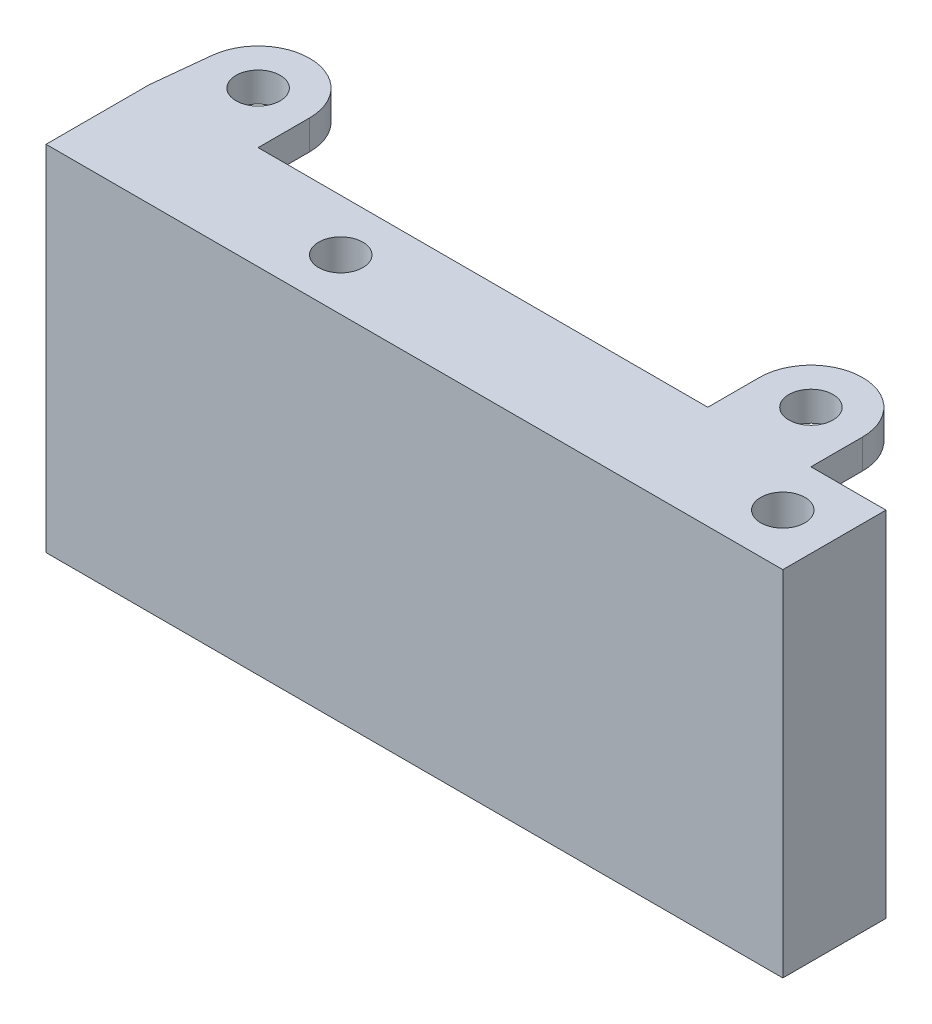
ISO-10303-21;
HEADER;
FILE_DESCRIPTION(('STEP AP214'),'2;1');
FILE_NAME('part.step','',(''),(''),'','','');
FILE_SCHEMA(('AUTOMOTIVE_DESIGN { 1 0 10303 214 1 1 1 1 }'));
ENDSEC;
DATA;
#1=APPLICATION_CONTEXT('core data for automotive mechanical design processes');
#2=APPLICATION_PROTOCOL_DEFINITION('international standard','automotive_design',2000,#1);
#3=PRODUCT_CONTEXT('',#1,'mechanical');
#4=PRODUCT('Part','Part','',(#3));
#5=PRODUCT_RELATED_PRODUCT_CATEGORY('part','',(#4));
#6=PRODUCT_DEFINITION_FORMATION('','',#4);
#7=PRODUCT_DEFINITION_CONTEXT('part definition',#1,'design');
#8=PRODUCT_DEFINITION('design','',#6,#7);
#9=PRODUCT_DEFINITION_SHAPE('','',#8);
#10=(LENGTH_UNIT() NAMED_UNIT(*) SI_UNIT(.MILLI.,.METRE.));
#11=(NAMED_UNIT(*) PLANE_ANGLE_UNIT() SI_UNIT($,.RADIAN.));
#12=(NAMED_UNIT(*) SI_UNIT($,.STERADIAN.) SOLID_ANGLE_UNIT());
#13=UNCERTAINTY_MEASURE_WITH_UNIT(LENGTH_MEASURE(1.E-05),#10,'distance_accuracy_value','');
#14=(GEOMETRIC_REPRESENTATION_CONTEXT(3) GLOBAL_UNCERTAINTY_ASSIGNED_CONTEXT((#13)) GLOBAL_UNIT_ASSIGNED_CONTEXT((#10,
#11,#12)) REPRESENTATION_CONTEXT('',''));
#15=CARTESIAN_POINT('',(0.,0.,0.));
#16=DIRECTION('',(0.,0.,1.));
#17=DIRECTION('',(1.,0.,0.));
#18=AXIS2_PLACEMENT_3D('',#15,#16,#17);
#19=CARTESIAN_POINT('',(0.,0.,0.));
#20=DIRECTION('',(0.,0.,1.));
#21=DIRECTION('',(1.,0.,0.));
#22=AXIS2_PLACEMENT_3D('',#19,#20,#21);
#23=PLANE('',#22);
#24=DIRECTION('',(0.,1.,0.));
#25=VECTOR('',#24,1.);
#26=CARTESIAN_POINT('',(37.910130543709,22.,0.));
#27=LINE('',#26,#25);
#28=CARTESIAN_POINT('',(37.910130543709,22.,0.));
#29=VERTEX_POINT('',#28);
#30=CARTESIAN_POINT('',(37.910130543709,24.,0.));
#31=VERTEX_POINT('',#30);
#32=EDGE_CURVE('E48',#29,#31,#27,.T.);
#33=ORIENTED_EDGE('',*,*,#32,.F.);
#34=DIRECTION('',(-1.,0.,0.));
#35=VECTOR('',#34,1.);
#36=CARTESIAN_POINT('',(50.,22.,0.));
#37=LINE('',#36,#35);
#38=CARTESIAN_POINT('',(44.910130543709,22.,0.));
#39=VERTEX_POINT('',#38);
#40=EDGE_CURVE('E171',#39,#29,#37,.T.);
#41=ORIENTED_EDGE('',*,*,#40,.F.);
#42=DIRECTION('',(0.,1.,0.));
#43=VECTOR('',#42,1.);
#44=CARTESIAN_POINT('',(44.910130543709,22.,0.));
#45=LINE('',#44,#43);
#46=CARTESIAN_POINT('',(44.910130543709,24.,0.));
#47=VERTEX_POINT('',#46);
#48=EDGE_CURVE('E326',#39,#47,#45,.T.);
#49=ORIENTED_EDGE('',*,*,#48,.T.);
#50=DIRECTION('',(-1.,0.,0.));
#51=VECTOR('',#50,1.);
#52=CARTESIAN_POINT('',(50.,24.,0.));
#53=LINE('',#52,#51);
#54=CARTESIAN_POINT('',(50.,24.,0.));
#55=VERTEX_POINT('',#54);
#56=EDGE_CURVE('E294',#55,#47,#53,.T.);
#57=ORIENTED_EDGE('',*,*,#56,.F.);
#58=DIRECTION('',(0.,1.,0.));
#59=VECTOR('',#58,1.);
#60=CARTESIAN_POINT('',(50.,0.,0.));
#61=LINE('',#60,#59);
#62=CARTESIAN_POINT('',(50.,0.,0.));
#63=VERTEX_POINT('',#62);
#64=EDGE_CURVE('E308',#63,#55,#61,.T.);
#65=ORIENTED_EDGE('',*,*,#64,.F.);
#66=DIRECTION('',(1.,0.,0.));
#67=VECTOR('',#66,1.);
#68=CARTESIAN_POINT('',(0.,0.,0.));
#69=LINE('',#68,#67);
#70=CARTESIAN_POINT('',(44.910130543709,0.,0.));
#71=VERTEX_POINT('',#70);
#72=EDGE_CURVE('E304',#71,#63,#69,.T.);
#73=ORIENTED_EDGE('',*,*,#72,.F.);
#74=DIRECTION('',(0.,-1.,0.));
#75=VECTOR('',#74,1.);
#76=CARTESIAN_POINT('',(44.910130543709,2.,0.));
#77=LINE('',#76,#75);
#78=CARTESIAN_POINT('',(44.910130543709,2.,0.));
#79=VERTEX_POINT('',#78);
#80=EDGE_CURVE('E249',#79,#71,#77,.T.);
#81=ORIENTED_EDGE('',*,*,#80,.F.);
#82=DIRECTION('',(-1.,0.,0.));
#83=VECTOR('',#82,1.);
#84=CARTESIAN_POINT('',(44.910130543709,2.,0.));
#85=LINE('',#84,#83);
#86=CARTESIAN_POINT('',(37.910130543709,2.,0.));
#87=VERTEX_POINT('',#86);
#88=EDGE_CURVE('E236',#79,#87,#85,.T.);
#89=ORIENTED_EDGE('',*,*,#88,.T.);
#90=DIRECTION('',(0.,-1.,0.));
#91=VECTOR('',#90,1.);
#92=CARTESIAN_POINT('',(37.910130543709,2.,0.));
#93=LINE('',#92,#91);
#94=CARTESIAN_POINT('',(37.910130543709,0.,0.));
#95=VERTEX_POINT('',#94);
#96=EDGE_CURVE('E245',#87,#95,#93,.T.);
#97=ORIENTED_EDGE('',*,*,#96,.T.);
#98=CARTESIAN_POINT('',(7.39152841971468,0.,0.));
#99=VERTEX_POINT('',#98);
#100=EDGE_CURVE('E305',#99,#95,#69,.T.);
#101=ORIENTED_EDGE('',*,*,#100,.F.);
#102=DIRECTION('',(0.,-1.,0.));
#103=VECTOR('',#102,1.);
#104=CARTESIAN_POINT('',(7.39152841971468,2.,0.));
#105=LINE('',#104,#103);
#106=CARTESIAN_POINT('',(7.39152841971468,2.,0.));
#107=VERTEX_POINT('',#106);
#108=EDGE_CURVE('E287',#107,#99,#105,.T.);
#109=ORIENTED_EDGE('',*,*,#108,.F.);
#110=DIRECTION('',(-1.,0.,0.));
#111=VECTOR('',#110,1.);
#112=CARTESIAN_POINT('',(7.39152841971468,2.,0.));
#113=LINE('',#112,#111);
#114=CARTESIAN_POINT('',(0.,2.,0.));
#115=VERTEX_POINT('',#114);
#116=EDGE_CURVE('E267',#107,#115,#113,.T.);
#117=ORIENTED_EDGE('',*,*,#116,.T.);
#118=DIRECTION('',(0.,-1.,0.));
#119=VECTOR('',#118,1.);
#120=CARTESIAN_POINT('',(0.,24.,0.));
#121=LINE('',#120,#119);
#122=CARTESIAN_POINT('',(0.,22.,0.));
#123=VERTEX_POINT('',#122);
#124=EDGE_CURVE('E283',#123,#115,#121,.T.);
#125=ORIENTED_EDGE('',*,*,#124,.F.);
#126=DIRECTION('',(-1.,0.,0.));
#127=VECTOR('',#126,1.);
#128=CARTESIAN_POINT('',(50.,22.,0.));
#129=LINE('',#128,#127);
#130=CARTESIAN_POINT('',(7.39152841971468,22.,0.));
#131=VERTEX_POINT('',#130);
#132=EDGE_CURVE('E198',#131,#123,#129,.T.);
#133=ORIENTED_EDGE('',*,*,#132,.F.);
#134=DIRECTION('',(0.,1.,0.));
#135=VECTOR('',#134,1.);
#136=CARTESIAN_POINT('',(7.39152841971468,22.,0.));
#137=LINE('',#136,#135);
#138=CARTESIAN_POINT('',(7.39152841971468,24.,0.));
#139=VERTEX_POINT('',#138);
#140=EDGE_CURVE('E208',#131,#139,#137,.T.);
#141=ORIENTED_EDGE('',*,*,#140,.T.);
#142=EDGE_CURVE('E185',#31,#139,#53,.T.);
#143=ORIENTED_EDGE('',*,*,#142,.F.);
#144=EDGE_LOOP('',(#33,#41,#49,#57,#65,#73,#81,#89,#97,#101,#109,#117,#125,#133,#141,#143));
#145=FACE_BOUND('',#144,.T.);
#146=ADVANCED_FACE('F33',(#145),#23,.F.);
#147=CARTESIAN_POINT('',(0.,24.,7.));
#148=DIRECTION('',(1.,0.,0.));
#149=DIRECTION('',(0.,0.,-1.));
#150=AXIS2_PLACEMENT_3D('',#147,#148,#149);
#151=PLANE('',#150);
#152=CARTESIAN_POINT('',(0.,24.,0.));
#153=VERTEX_POINT('',#152);
#154=EDGE_CURVE('E301',#153,#123,#121,.T.);
#155=ORIENTED_EDGE('',*,*,#154,.T.);
#156=ORIENTED_EDGE('',*,*,#124,.T.);
#157=DIRECTION('',(0.,-1.,0.));
#158=VECTOR('',#157,1.);
#159=CARTESIAN_POINT('',(0.,2.,0.));
#160=LINE('',#159,#158);
#161=CARTESIAN_POINT('',(0.,0.,0.));
#162=VERTEX_POINT('',#161);
#163=EDGE_CURVE('E284',#115,#162,#160,.T.);
#164=ORIENTED_EDGE('',*,*,#163,.T.);
#165=DIRECTION('',(0.,0.,-1.));
#166=VECTOR('',#165,1.);
#167=CARTESIAN_POINT('',(0.,0.,7.));
#168=LINE('',#167,#166);
#169=CARTESIAN_POINT('',(0.,0.,7.));
#170=VERTEX_POINT('',#169);
#171=EDGE_CURVE('E11',#170,#162,#168,.T.);
#172=ORIENTED_EDGE('',*,*,#171,.F.);
#173=DIRECTION('',(0.,-1.,0.));
#174=VECTOR('',#173,1.);
#175=CARTESIAN_POINT('',(0.,24.,7.));
#176=LINE('',#175,#174);
#177=CARTESIAN_POINT('',(0.,24.,7.));
#178=VERTEX_POINT('',#177);
#179=EDGE_CURVE('E290',#178,#170,#176,.T.);
#180=ORIENTED_EDGE('',*,*,#179,.F.);
#181=DIRECTION('',(0.,0.,-1.));
#182=VECTOR('',#181,1.);
#183=CARTESIAN_POINT('',(0.,24.,7.));
#184=LINE('',#183,#182);
#185=EDGE_CURVE('E300',#178,#153,#184,.T.);
#186=ORIENTED_EDGE('',*,*,#185,.T.);
#187=EDGE_LOOP('',(#155,#156,#164,#172,#180,#186));
#188=FACE_BOUND('',#187,.T.);
#189=ADVANCED_FACE('F35',(#188),#151,.F.);
#190=CARTESIAN_POINT('',(0.,0.,7.));
#191=DIRECTION('',(0.,1.,0.));
#192=DIRECTION('',(0.,0.,1.));
#193=AXIS2_PLACEMENT_3D('',#190,#191,#192);
#194=PLANE('',#193);
#195=CARTESIAN_POINT('',(16.5,0.,3.5));
#196=DIRECTION('',(0.,-1.,0.));
#197=DIRECTION('',(0.,0.,-1.));
#198=AXIS2_PLACEMENT_3D('',#195,#196,#197);
#199=CIRCLE('',#198,1.5);
#200=CARTESIAN_POINT('',(16.5,0.,2.));
#201=VERTEX_POINT('',#200);
#202=EDGE_CURVE('E402',#201,#201,#199,.T.);
#203=ORIENTED_EDGE('',*,*,#202,.F.);
#204=EDGE_LOOP('',(#203));
#205=FACE_BOUND('',#204,.T.);
#206=CARTESIAN_POINT('',(46.5,0.,3.5));
#207=DIRECTION('',(0.,-1.,0.));
#208=DIRECTION('',(0.,0.,-1.));
#209=AXIS2_PLACEMENT_3D('',#206,#207,#208);
#210=CIRCLE('',#209,1.5);
#211=CARTESIAN_POINT('',(46.5,0.,1.99999999999999));
#212=VERTEX_POINT('',#211);
#213=EDGE_CURVE('E405',#212,#212,#210,.T.);
#214=ORIENTED_EDGE('',*,*,#213,.F.);
#215=EDGE_LOOP('',(#214));
#216=FACE_BOUND('',#215,.T.);
#217=ORIENTED_EDGE('',*,*,#171,.T.);
#218=DIRECTION('',(0.105643357462021,0.,-0.994404083370614));
#219=VECTOR('',#218,1.);
#220=CARTESIAN_POINT('',(0.,0.,0.));
#221=LINE('',#220,#219);
#222=CARTESIAN_POINT('',(0.411114127917529,0.,-3.86975175111705));
#223=VERTEX_POINT('',#222);
#224=EDGE_CURVE('E264',#162,#223,#221,.T.);
#225=ORIENTED_EDGE('',*,*,#224,.T.);
#226=CARTESIAN_POINT('',(3.89152841971468,0.,-3.49999999999997));
#227=DIRECTION('',(0.,-1.,0.));
#228=DIRECTION('',(0.,0.,-1.));
#229=AXIS2_PLACEMENT_3D('',#226,#227,#228);
#230=CIRCLE('',#229,3.5);
#231=CARTESIAN_POINT('',(7.39152841971468,0.,-3.49999999999997));
#232=VERTEX_POINT('',#231);
#233=EDGE_CURVE('E257',#223,#232,#230,.T.);
#234=ORIENTED_EDGE('',*,*,#233,.T.);
#235=DIRECTION('',(0.,0.,1.));
#236=VECTOR('',#235,1.);
#237=CARTESIAN_POINT('',(7.39152841971468,0.,-3.49999999999997));
#238=LINE('',#237,#236);
#239=EDGE_CURVE('E276',#232,#99,#238,.T.);
#240=ORIENTED_EDGE('',*,*,#239,.T.);
#241=ORIENTED_EDGE('',*,*,#100,.T.);
#242=DIRECTION('',(0.,0.,-1.));
#243=VECTOR('',#242,1.);
#244=CARTESIAN_POINT('',(37.910130543709,0.,0.));
#245=LINE('',#244,#243);
#246=CARTESIAN_POINT('',(37.910130543709,0.,-3.49999999999997));
#247=VERTEX_POINT('',#246);
#248=EDGE_CURVE('E225',#95,#247,#245,.T.);
#249=ORIENTED_EDGE('',*,*,#248,.T.);
#250=CARTESIAN_POINT('',(41.410130543709,0.,-3.49999999999998));
#251=DIRECTION('',(0.,-1.,0.));
#252=DIRECTION('',(0.,0.,-1.));
#253=AXIS2_PLACEMENT_3D('',#250,#251,#252);
#254=CIRCLE('',#253,3.50000000000001);
#255=CARTESIAN_POINT('',(44.910130543709,0.,-3.49999999999998));
#256=VERTEX_POINT('',#255);
#257=EDGE_CURVE('E242',#247,#256,#254,.T.);
#258=ORIENTED_EDGE('',*,*,#257,.T.);
#259=DIRECTION('',(0.,0.,1.));
#260=VECTOR('',#259,1.);
#261=CARTESIAN_POINT('',(44.910130543709,0.,-3.49999999999998));
#262=LINE('',#261,#260);
#263=EDGE_CURVE('E56',#256,#71,#262,.T.);
#264=ORIENTED_EDGE('',*,*,#263,.T.);
#265=ORIENTED_EDGE('',*,*,#72,.T.);
#266=DIRECTION('',(0.,0.,-1.));
#267=VECTOR('',#266,1.);
#268=CARTESIAN_POINT('',(50.,0.,7.));
#269=LINE('',#268,#267);
#270=CARTESIAN_POINT('',(50.,0.,7.));
#271=VERTEX_POINT('',#270);
#272=EDGE_CURVE('E41',#271,#63,#269,.T.);
#273=ORIENTED_EDGE('',*,*,#272,.F.);
#274=DIRECTION('',(1.,0.,0.));
#275=VECTOR('',#274,1.);
#276=CARTESIAN_POINT('',(0.,0.,7.));
#277=LINE('',#276,#275);
#278=EDGE_CURVE('E293',#170,#271,#277,.T.);
#279=ORIENTED_EDGE('',*,*,#278,.F.);
#280=EDGE_LOOP('',(#217,#225,#234,#240,#241,#249,#258,#264,#265,#273,#279));
#281=FACE_BOUND('',#280,.T.);
#282=CARTESIAN_POINT('',(3.89152841971468,0.,-3.49999999999997));
#283=DIRECTION('',(0.,-1.,0.));
#284=DIRECTION('',(0.,0.,-1.));
#285=AXIS2_PLACEMENT_3D('',#282,#283,#284);
#286=CIRCLE('',#285,1.5);
#287=CARTESIAN_POINT('',(3.89152841971468,0.,-4.99999999999998));
#288=VERTEX_POINT('',#287);
#289=EDGE_CURVE('E248',#288,#288,#286,.T.);
#290=ORIENTED_EDGE('',*,*,#289,.F.);
#291=EDGE_LOOP('',(#290));
#292=FACE_BOUND('',#291,.T.);
#293=CARTESIAN_POINT('',(41.410130543709,0.,-3.49999999999998));
#294=DIRECTION('',(0.,-1.,0.));
#295=DIRECTION('',(0.,0.,-1.));
#296=AXIS2_PLACEMENT_3D('',#293,#294,#295);
#297=CIRCLE('',#296,1.5);
#298=CARTESIAN_POINT('',(41.410130543709,0.,-4.99999999999998));
#299=VERTEX_POINT('',#298);
#300=EDGE_CURVE('E221',#299,#299,#297,.T.);
#301=ORIENTED_EDGE('',*,*,#300,.F.);
#302=EDGE_LOOP('',(#301));
#303=FACE_BOUND('',#302,.T.);
#304=ADVANCED_FACE('F339',(#205,#216,#281,#292,#303),#194,.F.);
#305=CARTESIAN_POINT('',(50.,0.,7.));
#306=DIRECTION('',(-1.,0.,0.));
#307=DIRECTION('',(0.,0.,1.));
#308=AXIS2_PLACEMENT_3D('',#305,#306,#307);
#309=PLANE('',#308);
#310=ORIENTED_EDGE('',*,*,#64,.T.);
#311=DIRECTION('',(0.,0.,-1.));
#312=VECTOR('',#311,1.);
#313=CARTESIAN_POINT('',(50.,24.,7.));
#314=LINE('',#313,#312);
#315=CARTESIAN_POINT('',(50.,24.,7.));
#316=VERTEX_POINT('',#315);
#317=EDGE_CURVE('E314',#316,#55,#314,.T.);
#318=ORIENTED_EDGE('',*,*,#317,.F.);
#319=DIRECTION('',(0.,1.,0.));
#320=VECTOR('',#319,1.);
#321=CARTESIAN_POINT('',(50.,0.,7.));
#322=LINE('',#321,#320);
#323=EDGE_CURVE('E296',#271,#316,#322,.T.);
#324=ORIENTED_EDGE('',*,*,#323,.F.);
#325=ORIENTED_EDGE('',*,*,#272,.T.);
#326=EDGE_LOOP('',(#310,#318,#324,#325));
#327=FACE_BOUND('',#326,.T.);
#328=ADVANCED_FACE('F321',(#327),#309,.F.);
#329=CARTESIAN_POINT('',(50.,24.,7.));
#330=DIRECTION('',(0.,-1.,0.));
#331=DIRECTION('',(1.,0.,0.));
#332=AXIS2_PLACEMENT_3D('',#329,#330,#331);
#333=PLANE('',#332);
#334=CARTESIAN_POINT('',(16.5,24.,3.5));
#335=DIRECTION('',(0.,-1.,0.));
#336=DIRECTION('',(1.,0.,0.));
#337=AXIS2_PLACEMENT_3D('',#334,#335,#336);
#338=CIRCLE('',#337,1.5);
#339=CARTESIAN_POINT('',(16.5,24.,2.));
#340=VERTEX_POINT('',#339);
#341=EDGE_CURVE('E408',#340,#340,#338,.F.);
#342=ORIENTED_EDGE('',*,*,#341,.F.);
#343=EDGE_LOOP('',(#342));
#344=FACE_BOUND('',#343,.T.);
#345=CARTESIAN_POINT('',(46.5,24.,3.5));
#346=DIRECTION('',(0.,-1.,0.));
#347=DIRECTION('',(1.,0.,0.));
#348=AXIS2_PLACEMENT_3D('',#345,#346,#347);
#349=CIRCLE('',#348,1.5);
#350=CARTESIAN_POINT('',(48.,24.,3.5));
#351=VERTEX_POINT('',#350);
#352=EDGE_CURVE('E407',#351,#351,#349,.F.);
#353=ORIENTED_EDGE('',*,*,#352,.F.);
#354=EDGE_LOOP('',(#353));
#355=FACE_BOUND('',#354,.T.);
#356=ORIENTED_EDGE('',*,*,#56,.T.);
#357=DIRECTION('',(0.,0.,1.));
#358=VECTOR('',#357,1.);
#359=CARTESIAN_POINT('',(44.910130543709,24.,6.99999999999999));
#360=LINE('',#359,#358);
#361=CARTESIAN_POINT('',(44.910130543709,24.,-3.49999999999997));
#362=VERTEX_POINT('',#361);
#363=EDGE_CURVE('E181',#362,#47,#360,.T.);
#364=ORIENTED_EDGE('',*,*,#363,.F.);
#365=CARTESIAN_POINT('',(41.410130543709,24.,-3.49999999999998));
#366=DIRECTION('',(0.,-1.,0.));
#367=DIRECTION('',(1.,0.,0.));
#368=AXIS2_PLACEMENT_3D('',#365,#366,#367);
#369=CIRCLE('',#368,3.50000000000001);
#370=CARTESIAN_POINT('',(37.910130543709,24.,-3.49999999999997));
#371=VERTEX_POINT('',#370);
#372=EDGE_CURVE('E426',#371,#362,#369,.T.);
#373=ORIENTED_EDGE('',*,*,#372,.F.);
#374=DIRECTION('',(0.,0.,-1.));
#375=VECTOR('',#374,1.);
#376=CARTESIAN_POINT('',(37.910130543709,24.,7.));
#377=LINE('',#376,#375);
#378=EDGE_CURVE('E420',#31,#371,#377,.T.);
#379=ORIENTED_EDGE('',*,*,#378,.F.);
#380=ORIENTED_EDGE('',*,*,#142,.T.);
#381=DIRECTION('',(0.,0.,1.));
#382=VECTOR('',#381,1.);
#383=CARTESIAN_POINT('',(7.39152841971468,24.,7.));
#384=LINE('',#383,#382);
#385=CARTESIAN_POINT('',(7.39152841971468,24.,-3.49999999999997));
#386=VERTEX_POINT('',#385);
#387=EDGE_CURVE('E202',#386,#139,#384,.T.);
#388=ORIENTED_EDGE('',*,*,#387,.F.);
#389=CARTESIAN_POINT('',(3.89152841971468,24.,-3.49999999999997));
#390=DIRECTION('',(0.,-1.,0.));
#391=DIRECTION('',(1.,0.,0.));
#392=AXIS2_PLACEMENT_3D('',#389,#390,#391);
#393=CIRCLE('',#392,3.5);
#394=CARTESIAN_POINT('',(0.411114127917529,24.,-3.86975175111705));
#395=VERTEX_POINT('',#394);
#396=EDGE_CURVE('E210',#395,#386,#393,.T.);
#397=ORIENTED_EDGE('',*,*,#396,.F.);
#398=DIRECTION('',(0.105643357462021,0.,-0.994404083370614));
#399=VECTOR('',#398,1.);
#400=CARTESIAN_POINT('',(-0.177339353496092,24.,1.66926706510831));
#401=LINE('',#400,#399);
#402=EDGE_CURVE('E196',#153,#395,#401,.T.);
#403=ORIENTED_EDGE('',*,*,#402,.F.);
#404=ORIENTED_EDGE('',*,*,#185,.F.);
#405=DIRECTION('',(-1.,0.,0.));
#406=VECTOR('',#405,1.);
#407=CARTESIAN_POINT('',(50.,24.,7.));
#408=LINE('',#407,#406);
#409=EDGE_CURVE('E298',#316,#178,#408,.T.);
#410=ORIENTED_EDGE('',*,*,#409,.F.);
#411=ORIENTED_EDGE('',*,*,#317,.T.);
#412=EDGE_LOOP('',(#356,#364,#373,#379,#380,#388,#397,#403,#404,#410,#411));
#413=FACE_BOUND('',#412,.T.);
#414=CARTESIAN_POINT('',(3.89152841971468,24.,-3.49999999999997));
#415=DIRECTION('',(0.,-1.,0.));
#416=DIRECTION('',(1.,0.,0.));
#417=AXIS2_PLACEMENT_3D('',#414,#415,#416);
#418=CIRCLE('',#417,1.5);
#419=CARTESIAN_POINT('',(5.39152841971468,24.,-3.49999999999997));
#420=VERTEX_POINT('',#419);
#421=EDGE_CURVE('E186',#420,#420,#418,.T.);
#422=ORIENTED_EDGE('',*,*,#421,.T.);
#423=EDGE_LOOP('',(#422));
#424=FACE_BOUND('',#423,.T.);
#425=CARTESIAN_POINT('',(41.410130543709,24.,-3.49999999999998));
#426=DIRECTION('',(0.,-1.,0.));
#427=DIRECTION('',(1.,0.,0.));
#428=AXIS2_PLACEMENT_3D('',#425,#426,#427);
#429=CIRCLE('',#428,1.5);
#430=CARTESIAN_POINT('',(42.910130543709,24.,-3.49999999999998));
#431=VERTEX_POINT('',#430);
#432=EDGE_CURVE('E411',#431,#431,#429,.T.);
#433=ORIENTED_EDGE('',*,*,#432,.T.);
#434=EDGE_LOOP('',(#433));
#435=FACE_BOUND('',#434,.T.);
#436=ADVANCED_FACE('F329',(#344,#355,#413,#424,#435),#333,.F.);
#437=CARTESIAN_POINT('',(0.,0.,7.));
#438=DIRECTION('',(0.,0.,1.));
#439=DIRECTION('',(1.,0.,0.));
#440=AXIS2_PLACEMENT_3D('',#437,#438,#439);
#441=PLANE('',#440);
#442=ORIENTED_EDGE('',*,*,#179,.T.);
#443=ORIENTED_EDGE('',*,*,#278,.T.);
#444=ORIENTED_EDGE('',*,*,#323,.T.);
#445=ORIENTED_EDGE('',*,*,#409,.T.);
#446=EDGE_LOOP('',(#442,#443,#444,#445));
#447=FACE_BOUND('',#446,.T.);
#448=ADVANCED_FACE('F337',(#447),#441,.T.);
#449=CARTESIAN_POINT('',(3.89152841971468,2.,-3.49999999999997));
#450=DIRECTION('',(0.,-1.,0.));
#451=DIRECTION('',(0.,0.,-1.));
#452=AXIS2_PLACEMENT_3D('',#449,#450,#451);
#453=CYLINDRICAL_SURFACE('',#452,3.5);
#454=ORIENTED_EDGE('',*,*,#233,.F.);
#455=DIRECTION('',(0.,-1.,0.));
#456=VECTOR('',#455,1.);
#457=CARTESIAN_POINT('',(0.411114127917529,2.,-3.86975175111705));
#458=LINE('',#457,#456);
#459=CARTESIAN_POINT('',(0.411114127917529,2.,-3.86975175111705));
#460=VERTEX_POINT('',#459);
#461=EDGE_CURVE('E281',#460,#223,#458,.T.);
#462=ORIENTED_EDGE('',*,*,#461,.F.);
#463=CARTESIAN_POINT('',(3.89152841971468,2.,-3.49999999999997));
#464=DIRECTION('',(0.,-1.,0.));
#465=DIRECTION('',(0.,0.,-1.));
#466=AXIS2_PLACEMENT_3D('',#463,#464,#465);
#467=CIRCLE('',#466,3.5);
#468=CARTESIAN_POINT('',(7.39152841971468,2.,-3.49999999999997));
#469=VERTEX_POINT('',#468);
#470=EDGE_CURVE('E260',#460,#469,#467,.T.);
#471=ORIENTED_EDGE('',*,*,#470,.T.);
#472=DIRECTION('',(0.,-1.,0.));
#473=VECTOR('',#472,1.);
#474=CARTESIAN_POINT('',(7.39152841971468,2.,-3.49999999999997));
#475=LINE('',#474,#473);
#476=EDGE_CURVE('E273',#469,#232,#475,.T.);
#477=ORIENTED_EDGE('',*,*,#476,.T.);
#478=EDGE_LOOP('',(#454,#462,#471,#477));
#479=FACE_BOUND('',#478,.T.);
#480=ADVANCED_FACE('F359',(#479),#453,.T.);
#481=CARTESIAN_POINT('',(0.,2.,0.));
#482=DIRECTION('',(-0.994404083370614,0.,-0.105643357462021));
#483=DIRECTION('',(-0.105643357462021,0.,0.994404083370614));
#484=AXIS2_PLACEMENT_3D('',#481,#482,#483);
#485=PLANE('',#484);
#486=ORIENTED_EDGE('',*,*,#224,.F.);
#487=ORIENTED_EDGE('',*,*,#163,.F.);
#488=DIRECTION('',(0.105643357462021,0.,-0.994404083370614));
#489=VECTOR('',#488,1.);
#490=CARTESIAN_POINT('',(0.,2.,0.));
#491=LINE('',#490,#489);
#492=EDGE_CURVE('E270',#115,#460,#491,.T.);
#493=ORIENTED_EDGE('',*,*,#492,.T.);
#494=ORIENTED_EDGE('',*,*,#461,.T.);
#495=EDGE_LOOP('',(#486,#487,#493,#494));
#496=FACE_BOUND('',#495,.T.);
#497=ADVANCED_FACE('F346',(#496),#485,.T.);
#498=CARTESIAN_POINT('',(7.39152841971468,2.,-3.49999999999997));
#499=DIRECTION('',(1.,0.,0.));
#500=DIRECTION('',(0.,0.,-1.));
#501=AXIS2_PLACEMENT_3D('',#498,#499,#500);
#502=PLANE('',#501);
#503=ORIENTED_EDGE('',*,*,#239,.F.);
#504=ORIENTED_EDGE('',*,*,#476,.F.);
#505=DIRECTION('',(0.,0.,1.));
#506=VECTOR('',#505,1.);
#507=CARTESIAN_POINT('',(7.39152841971468,2.,-3.49999999999997));
#508=LINE('',#507,#506);
#509=EDGE_CURVE('E263',#469,#107,#508,.T.);
#510=ORIENTED_EDGE('',*,*,#509,.T.);
#511=ORIENTED_EDGE('',*,*,#108,.T.);
#512=EDGE_LOOP('',(#503,#504,#510,#511));
#513=FACE_BOUND('',#512,.T.);
#514=ADVANCED_FACE('F356',(#513),#502,.T.);
#515=CARTESIAN_POINT('',(3.89152841971468,2.,-3.49999999999997));
#516=DIRECTION('',(0.,-1.,0.));
#517=DIRECTION('',(0.,0.,-1.));
#518=AXIS2_PLACEMENT_3D('',#515,#516,#517);
#519=PLANE('',#518);
#520=CARTESIAN_POINT('',(3.89152841971468,2.,-3.49999999999997));
#521=DIRECTION('',(0.,-1.,0.));
#522=DIRECTION('',(0.,0.,-1.));
#523=AXIS2_PLACEMENT_3D('',#520,#521,#522);
#524=CIRCLE('',#523,1.5);
#525=CARTESIAN_POINT('',(3.89152841971468,2.,-4.99999999999998));
#526=VERTEX_POINT('',#525);
#527=EDGE_CURVE('E254',#526,#526,#524,.T.);
#528=ORIENTED_EDGE('',*,*,#527,.T.);
#529=EDGE_LOOP('',(#528));
#530=FACE_BOUND('',#529,.T.);
#531=ORIENTED_EDGE('',*,*,#470,.F.);
#532=ORIENTED_EDGE('',*,*,#492,.F.);
#533=ORIENTED_EDGE('',*,*,#116,.F.);
#534=ORIENTED_EDGE('',*,*,#509,.F.);
#535=EDGE_LOOP('',(#531,#532,#533,#534));
#536=FACE_BOUND('',#535,.T.);
#537=ADVANCED_FACE('F353',(#530,#536),#519,.F.);
#538=CARTESIAN_POINT('',(3.89152841971468,2.,-3.49999999999997));
#539=DIRECTION('',(0.,-1.,0.));
#540=DIRECTION('',(0.,0.,-1.));
#541=AXIS2_PLACEMENT_3D('',#538,#539,#540);
#542=CYLINDRICAL_SURFACE('',#541,1.5);
#543=ORIENTED_EDGE('',*,*,#527,.F.);
#544=EDGE_LOOP('',(#543));
#545=FACE_BOUND('',#544,.T.);
#546=ORIENTED_EDGE('',*,*,#289,.T.);
#547=EDGE_LOOP('',(#546));
#548=FACE_BOUND('',#547,.T.);
#549=ADVANCED_FACE('F380',(#545,#548),#542,.F.);
#550=CARTESIAN_POINT('',(37.910130543709,2.,0.));
#551=DIRECTION('',(-1.,0.,0.));
#552=DIRECTION('',(0.,0.,1.));
#553=AXIS2_PLACEMENT_3D('',#550,#551,#552);
#554=PLANE('',#553);
#555=ORIENTED_EDGE('',*,*,#248,.F.);
#556=ORIENTED_EDGE('',*,*,#96,.F.);
#557=DIRECTION('',(0.,0.,-1.));
#558=VECTOR('',#557,1.);
#559=CARTESIAN_POINT('',(37.910130543709,2.,0.));
#560=LINE('',#559,#558);
#561=CARTESIAN_POINT('',(37.910130543709,2.,-3.49999999999997));
#562=VERTEX_POINT('',#561);
#563=EDGE_CURVE('E228',#87,#562,#560,.T.);
#564=ORIENTED_EDGE('',*,*,#563,.T.);
#565=DIRECTION('',(0.,-1.,0.));
#566=VECTOR('',#565,1.);
#567=CARTESIAN_POINT('',(37.910130543709,2.,-3.49999999999997));
#568=LINE('',#567,#566);
#569=EDGE_CURVE('E239',#562,#247,#568,.T.);
#570=ORIENTED_EDGE('',*,*,#569,.T.);
#571=EDGE_LOOP('',(#555,#556,#564,#570));
#572=FACE_BOUND('',#571,.T.);
#573=ADVANCED_FACE('F363',(#572),#554,.T.);
#574=CARTESIAN_POINT('',(44.910130543709,2.,-3.49999999999998));
#575=DIRECTION('',(1.,0.,0.));
#576=DIRECTION('',(0.,0.,-1.));
#577=AXIS2_PLACEMENT_3D('',#574,#575,#576);
#578=PLANE('',#577);
#579=ORIENTED_EDGE('',*,*,#263,.F.);
#580=DIRECTION('',(0.,-1.,0.));
#581=VECTOR('',#580,1.);
#582=CARTESIAN_POINT('',(44.910130543709,2.,-3.49999999999998));
#583=LINE('',#582,#581);
#584=CARTESIAN_POINT('',(44.910130543709,2.,-3.49999999999998));
#585=VERTEX_POINT('',#584);
#586=EDGE_CURVE('E251',#585,#256,#583,.T.);
#587=ORIENTED_EDGE('',*,*,#586,.F.);
#588=DIRECTION('',(0.,0.,1.));
#589=VECTOR('',#588,1.);
#590=CARTESIAN_POINT('',(44.910130543709,2.,-3.49999999999998));
#591=LINE('',#590,#589);
#592=EDGE_CURVE('E234',#585,#79,#591,.T.);
#593=ORIENTED_EDGE('',*,*,#592,.T.);
#594=ORIENTED_EDGE('',*,*,#80,.T.);
#595=EDGE_LOOP('',(#579,#587,#593,#594));
#596=FACE_BOUND('',#595,.T.);
#597=ADVANCED_FACE('F372',(#596),#578,.T.);
#598=CARTESIAN_POINT('',(41.410130543709,2.,-3.49999999999998));
#599=DIRECTION('',(0.,-1.,0.));
#600=DIRECTION('',(0.,0.,-1.));
#601=AXIS2_PLACEMENT_3D('',#598,#599,#600);
#602=CYLINDRICAL_SURFACE('',#601,3.50000000000001);
#603=ORIENTED_EDGE('',*,*,#257,.F.);
#604=ORIENTED_EDGE('',*,*,#569,.F.);
#605=CARTESIAN_POINT('',(41.410130543709,2.,-3.49999999999998));
#606=DIRECTION('',(0.,-1.,0.));
#607=DIRECTION('',(0.,0.,-1.));
#608=AXIS2_PLACEMENT_3D('',#605,#606,#607);
#609=CIRCLE('',#608,3.50000000000001);
#610=EDGE_CURVE('E231',#562,#585,#609,.T.);
#611=ORIENTED_EDGE('',*,*,#610,.T.);
#612=ORIENTED_EDGE('',*,*,#586,.T.);
#613=EDGE_LOOP('',(#603,#604,#611,#612));
#614=FACE_BOUND('',#613,.T.);
#615=ADVANCED_FACE('F370',(#614),#602,.T.);
#616=CARTESIAN_POINT('',(41.410130543709,2.,-3.49999999999998));
#617=DIRECTION('',(0.,-1.,0.));
#618=DIRECTION('',(0.,0.,-1.));
#619=AXIS2_PLACEMENT_3D('',#616,#617,#618);
#620=PLANE('',#619);
#621=CARTESIAN_POINT('',(41.410130543709,2.,-3.49999999999998));
#622=DIRECTION('',(0.,-1.,0.));
#623=DIRECTION('',(0.,0.,-1.));
#624=AXIS2_PLACEMENT_3D('',#621,#622,#623);
#625=CIRCLE('',#624,1.5);
#626=CARTESIAN_POINT('',(41.410130543709,2.,-4.99999999999998));
#627=VERTEX_POINT('',#626);
#628=EDGE_CURVE('E222',#627,#627,#625,.T.);
#629=ORIENTED_EDGE('',*,*,#628,.T.);
#630=EDGE_LOOP('',(#629));
#631=FACE_BOUND('',#630,.T.);
#632=ORIENTED_EDGE('',*,*,#563,.F.);
#633=ORIENTED_EDGE('',*,*,#88,.F.);
#634=ORIENTED_EDGE('',*,*,#592,.F.);
#635=ORIENTED_EDGE('',*,*,#610,.F.);
#636=EDGE_LOOP('',(#632,#633,#634,#635));
#637=FACE_BOUND('',#636,.T.);
#638=ADVANCED_FACE('F366',(#631,#637),#620,.F.);
#639=CARTESIAN_POINT('',(41.410130543709,2.,-3.49999999999998));
#640=DIRECTION('',(0.,-1.,0.));
#641=DIRECTION('',(0.,0.,-1.));
#642=AXIS2_PLACEMENT_3D('',#639,#640,#641);
#643=CYLINDRICAL_SURFACE('',#642,1.5);
#644=ORIENTED_EDGE('',*,*,#628,.F.);
#645=EDGE_LOOP('',(#644));
#646=FACE_BOUND('',#645,.T.);
#647=ORIENTED_EDGE('',*,*,#300,.T.);
#648=EDGE_LOOP('',(#647));
#649=FACE_BOUND('',#648,.T.);
#650=ADVANCED_FACE('F458',(#646,#649),#643,.F.);
#651=CARTESIAN_POINT('',(3.89152841971468,22.,-3.49999999999997));
#652=DIRECTION('',(0.,-1.,0.));
#653=DIRECTION('',(1.,0.,0.));
#654=AXIS2_PLACEMENT_3D('',#651,#652,#653);
#655=PLANE('',#654);
#656=ORIENTED_EDGE('',*,*,#132,.T.);
#657=DIRECTION('',(0.105643357462021,0.,-0.994404083370614));
#658=VECTOR('',#657,1.);
#659=CARTESIAN_POINT('',(-0.177339353496092,22.,1.66926706510831));
#660=LINE('',#659,#658);
#661=CARTESIAN_POINT('',(0.411114127917529,22.,-3.86975175111705));
#662=VERTEX_POINT('',#661);
#663=EDGE_CURVE('E201',#123,#662,#660,.T.);
#664=ORIENTED_EDGE('',*,*,#663,.T.);
#665=CARTESIAN_POINT('',(3.89152841971468,22.,-3.49999999999997));
#666=DIRECTION('',(0.,-1.,0.));
#667=DIRECTION('',(1.,0.,0.));
#668=AXIS2_PLACEMENT_3D('',#665,#666,#667);
#669=CIRCLE('',#668,3.5);
#670=CARTESIAN_POINT('',(7.39152841971468,22.,-3.49999999999997));
#671=VERTEX_POINT('',#670);
#672=EDGE_CURVE('E204',#662,#671,#669,.T.);
#673=ORIENTED_EDGE('',*,*,#672,.T.);
#674=DIRECTION('',(0.,0.,1.));
#675=VECTOR('',#674,1.);
#676=CARTESIAN_POINT('',(7.39152841971468,22.,7.));
#677=LINE('',#676,#675);
#678=EDGE_CURVE('E206',#671,#131,#677,.T.);
#679=ORIENTED_EDGE('',*,*,#678,.T.);
#680=EDGE_LOOP('',(#656,#664,#673,#679));
#681=FACE_BOUND('',#680,.T.);
#682=CARTESIAN_POINT('',(3.89152841971468,22.,-3.49999999999997));
#683=DIRECTION('',(0.,-1.,0.));
#684=DIRECTION('',(1.,0.,0.));
#685=AXIS2_PLACEMENT_3D('',#682,#683,#684);
#686=CIRCLE('',#685,1.5);
#687=CARTESIAN_POINT('',(5.39152841971468,22.,-3.49999999999997));
#688=VERTEX_POINT('',#687);
#689=EDGE_CURVE('E189',#688,#688,#686,.T.);
#690=ORIENTED_EDGE('',*,*,#689,.F.);
#691=EDGE_LOOP('',(#690));
#692=FACE_BOUND('',#691,.T.);
#693=ADVANCED_FACE('F443',(#681,#692),#655,.T.);
#694=CARTESIAN_POINT('',(-0.177339353496092,22.,1.66926706510831));
#695=DIRECTION('',(0.994404083370614,0.,0.105643357462021));
#696=DIRECTION('',(0.105643357462021,0.,-0.994404083370614));
#697=AXIS2_PLACEMENT_3D('',#694,#695,#696);
#698=PLANE('',#697);
#699=ORIENTED_EDGE('',*,*,#402,.T.);
#700=DIRECTION('',(0.,1.,0.));
#701=VECTOR('',#700,1.);
#702=CARTESIAN_POINT('',(0.411114127917529,22.,-3.86975175111705));
#703=LINE('',#702,#701);
#704=EDGE_CURVE('E218',#662,#395,#703,.T.);
#705=ORIENTED_EDGE('',*,*,#704,.F.);
#706=ORIENTED_EDGE('',*,*,#663,.F.);
#707=ORIENTED_EDGE('',*,*,#154,.F.);
#708=EDGE_LOOP('',(#699,#705,#706,#707));
#709=FACE_BOUND('',#708,.T.);
#710=ADVANCED_FACE('F450',(#709),#698,.F.);
#711=CARTESIAN_POINT('',(3.89152841971468,22.,-3.49999999999997));
#712=DIRECTION('',(0.,1.,0.));
#713=DIRECTION('',(0.,0.,1.));
#714=AXIS2_PLACEMENT_3D('',#711,#712,#713);
#715=CYLINDRICAL_SURFACE('',#714,3.5);
#716=ORIENTED_EDGE('',*,*,#396,.T.);
#717=DIRECTION('',(0.,1.,0.));
#718=VECTOR('',#717,1.);
#719=CARTESIAN_POINT('',(7.39152841971468,22.,-3.49999999999997));
#720=LINE('',#719,#718);
#721=EDGE_CURVE('E215',#671,#386,#720,.T.);
#722=ORIENTED_EDGE('',*,*,#721,.F.);
#723=ORIENTED_EDGE('',*,*,#672,.F.);
#724=ORIENTED_EDGE('',*,*,#704,.T.);
#725=EDGE_LOOP('',(#716,#722,#723,#724));
#726=FACE_BOUND('',#725,.T.);
#727=ADVANCED_FACE('F448',(#726),#715,.T.);
#728=CARTESIAN_POINT('',(7.39152841971468,22.,7.));
#729=DIRECTION('',(-1.,0.,0.));
#730=DIRECTION('',(0.,0.,1.));
#731=AXIS2_PLACEMENT_3D('',#728,#729,#730);
#732=PLANE('',#731);
#733=ORIENTED_EDGE('',*,*,#387,.T.);
#734=ORIENTED_EDGE('',*,*,#140,.F.);
#735=ORIENTED_EDGE('',*,*,#678,.F.);
#736=ORIENTED_EDGE('',*,*,#721,.T.);
#737=EDGE_LOOP('',(#733,#734,#735,#736));
#738=FACE_BOUND('',#737,.T.);
#739=ADVANCED_FACE('F439',(#738),#732,.F.);
#740=CARTESIAN_POINT('',(3.89152841971468,22.,-3.49999999999997));
#741=DIRECTION('',(0.,1.,0.));
#742=DIRECTION('',(0.,0.,1.));
#743=AXIS2_PLACEMENT_3D('',#740,#741,#742);
#744=CYLINDRICAL_SURFACE('',#743,1.5);
#745=ORIENTED_EDGE('',*,*,#689,.T.);
#746=EDGE_LOOP('',(#745));
#747=FACE_BOUND('',#746,.T.);
#748=ORIENTED_EDGE('',*,*,#421,.F.);
#749=EDGE_LOOP('',(#748));
#750=FACE_BOUND('',#749,.T.);
#751=ADVANCED_FACE('F505',(#747,#750),#744,.F.);
#752=CARTESIAN_POINT('',(41.410130543709,22.,-3.49999999999998));
#753=DIRECTION('',(0.,-1.,0.));
#754=DIRECTION('',(1.,0.,0.));
#755=AXIS2_PLACEMENT_3D('',#752,#753,#754);
#756=PLANE('',#755);
#757=ORIENTED_EDGE('',*,*,#40,.T.);
#758=DIRECTION('',(0.,0.,-1.));
#759=VECTOR('',#758,1.);
#760=CARTESIAN_POINT('',(37.910130543709,22.,7.));
#761=LINE('',#760,#759);
#762=CARTESIAN_POINT('',(37.910130543709,22.,-3.49999999999997));
#763=VERTEX_POINT('',#762);
#764=EDGE_CURVE('E163',#29,#763,#761,.T.);
#765=ORIENTED_EDGE('',*,*,#764,.T.);
#766=CARTESIAN_POINT('',(41.410130543709,22.,-3.49999999999998));
#767=DIRECTION('',(0.,-1.,0.));
#768=DIRECTION('',(1.,0.,0.));
#769=AXIS2_PLACEMENT_3D('',#766,#767,#768);
#770=CIRCLE('',#769,3.50000000000001);
#771=CARTESIAN_POINT('',(44.910130543709,22.,-3.49999999999997));
#772=VERTEX_POINT('',#771);
#773=EDGE_CURVE('E170',#763,#772,#770,.T.);
#774=ORIENTED_EDGE('',*,*,#773,.T.);
#775=DIRECTION('',(0.,0.,1.));
#776=VECTOR('',#775,1.);
#777=CARTESIAN_POINT('',(44.910130543709,22.,6.99999999999999));
#778=LINE('',#777,#776);
#779=EDGE_CURVE('E177',#772,#39,#778,.T.);
#780=ORIENTED_EDGE('',*,*,#779,.T.);
#781=EDGE_LOOP('',(#757,#765,#774,#780));
#782=FACE_BOUND('',#781,.T.);
#783=CARTESIAN_POINT('',(41.410130543709,22.,-3.49999999999998));
#784=DIRECTION('',(0.,-1.,0.));
#785=DIRECTION('',(1.,0.,0.));
#786=AXIS2_PLACEMENT_3D('',#783,#784,#785);
#787=CIRCLE('',#786,1.5);
#788=CARTESIAN_POINT('',(42.910130543709,22.,-3.49999999999998));
#789=VERTEX_POINT('',#788);
#790=EDGE_CURVE('E417',#789,#789,#787,.T.);
#791=ORIENTED_EDGE('',*,*,#790,.F.);
#792=EDGE_LOOP('',(#791));
#793=FACE_BOUND('',#792,.T.);
#794=ADVANCED_FACE('F174',(#782,#793),#756,.T.);
#795=CARTESIAN_POINT('',(37.910130543709,22.,7.));
#796=DIRECTION('',(1.,0.,0.));
#797=DIRECTION('',(0.,0.,-1.));
#798=AXIS2_PLACEMENT_3D('',#795,#796,#797);
#799=PLANE('',#798);
#800=ORIENTED_EDGE('',*,*,#378,.T.);
#801=DIRECTION('',(0.,1.,0.));
#802=VECTOR('',#801,1.);
#803=CARTESIAN_POINT('',(37.910130543709,22.,-3.49999999999997));
#804=LINE('',#803,#802);
#805=EDGE_CURVE('E167',#763,#371,#804,.T.);
#806=ORIENTED_EDGE('',*,*,#805,.F.);
#807=ORIENTED_EDGE('',*,*,#764,.F.);
#808=ORIENTED_EDGE('',*,*,#32,.T.);
#809=EDGE_LOOP('',(#800,#806,#807,#808));
#810=FACE_BOUND('',#809,.T.);
#811=ADVANCED_FACE('F165',(#810),#799,.F.);
#812=CARTESIAN_POINT('',(41.410130543709,22.,-3.49999999999998));
#813=DIRECTION('',(0.,1.,0.));
#814=DIRECTION('',(0.,0.,1.));
#815=AXIS2_PLACEMENT_3D('',#812,#813,#814);
#816=CYLINDRICAL_SURFACE('',#815,3.50000000000001);
#817=ORIENTED_EDGE('',*,*,#372,.T.);
#818=DIRECTION('',(0.,1.,0.));
#819=VECTOR('',#818,1.);
#820=CARTESIAN_POINT('',(44.910130543709,22.,-3.49999999999997));
#821=LINE('',#820,#819);
#822=EDGE_CURVE('E191',#772,#362,#821,.T.);
#823=ORIENTED_EDGE('',*,*,#822,.F.);
#824=ORIENTED_EDGE('',*,*,#773,.F.);
#825=ORIENTED_EDGE('',*,*,#805,.T.);
#826=EDGE_LOOP('',(#817,#823,#824,#825));
#827=FACE_BOUND('',#826,.T.);
#828=ADVANCED_FACE('F434',(#827),#816,.T.);
#829=CARTESIAN_POINT('',(44.910130543709,22.,6.99999999999999));
#830=DIRECTION('',(-1.,0.,0.));
#831=DIRECTION('',(0.,0.,1.));
#832=AXIS2_PLACEMENT_3D('',#829,#830,#831);
#833=PLANE('',#832);
#834=ORIENTED_EDGE('',*,*,#363,.T.);
#835=ORIENTED_EDGE('',*,*,#48,.F.);
#836=ORIENTED_EDGE('',*,*,#779,.F.);
#837=ORIENTED_EDGE('',*,*,#822,.T.);
#838=EDGE_LOOP('',(#834,#835,#836,#837));
#839=FACE_BOUND('',#838,.T.);
#840=ADVANCED_FACE('F432',(#839),#833,.F.);
#841=CARTESIAN_POINT('',(41.410130543709,22.,-3.49999999999998));
#842=DIRECTION('',(0.,1.,0.));
#843=DIRECTION('',(0.,0.,1.));
#844=AXIS2_PLACEMENT_3D('',#841,#842,#843);
#845=CYLINDRICAL_SURFACE('',#844,1.5);
#846=ORIENTED_EDGE('',*,*,#790,.T.);
#847=EDGE_LOOP('',(#846));
#848=FACE_BOUND('',#847,.T.);
#849=ORIENTED_EDGE('',*,*,#432,.F.);
#850=EDGE_LOOP('',(#849));
#851=FACE_BOUND('',#850,.T.);
#852=ADVANCED_FACE('F546',(#848,#851),#845,.F.);
#853=CARTESIAN_POINT('',(46.5,28.2426406871193,3.5));
#854=DIRECTION('',(0.,-1.,0.));
#855=DIRECTION('',(0.,0.,-1.));
#856=AXIS2_PLACEMENT_3D('',#853,#854,#855);
#857=CYLINDRICAL_SURFACE('',#856,1.5);
#858=ORIENTED_EDGE('',*,*,#352,.T.);
#859=EDGE_LOOP('',(#858));
#860=FACE_BOUND('',#859,.T.);
#861=ORIENTED_EDGE('',*,*,#213,.T.);
#862=EDGE_LOOP('',(#861));
#863=FACE_BOUND('',#862,.T.);
#864=ADVANCED_FACE('F555',(#860,#863),#857,.F.);
#865=CARTESIAN_POINT('',(16.5,28.2426406871193,3.5));
#866=DIRECTION('',(0.,-1.,0.));
#867=DIRECTION('',(0.,0.,-1.));
#868=AXIS2_PLACEMENT_3D('',#865,#866,#867);
#869=CYLINDRICAL_SURFACE('',#868,1.5);
#870=CARTESIAN_POINT('',(16.5,24.,2.));
#871=CARTESIAN_POINT('',(16.5,23.75,2.));
#872=CARTESIAN_POINT('',(16.5,23.5,2.));
#873=CARTESIAN_POINT('',(16.5,23.,2.));
#874=CARTESIAN_POINT('',(16.5,22.75,2.));
#875=CARTESIAN_POINT('',(16.5,22.25,2.));
#876=CARTESIAN_POINT('',(16.5,22.,2.));
#877=CARTESIAN_POINT('',(16.5,21.5,2.));
#878=CARTESIAN_POINT('',(16.5,21.25,2.));
#879=CARTESIAN_POINT('',(16.5,20.75,2.));
#880=CARTESIAN_POINT('',(16.5,20.5,2.));
#881=CARTESIAN_POINT('',(16.5,20.,2.));
#882=CARTESIAN_POINT('',(16.5,19.75,2.));
#883=CARTESIAN_POINT('',(16.5,19.25,2.));
#884=CARTESIAN_POINT('',(16.5,19.,2.));
#885=CARTESIAN_POINT('',(16.5,18.5,2.));
#886=CARTESIAN_POINT('',(16.5,18.25,2.));
#887=CARTESIAN_POINT('',(16.5,17.75,2.));
#888=CARTESIAN_POINT('',(16.5,17.5,2.));
#889=CARTESIAN_POINT('',(16.5,17.,2.));
#890=CARTESIAN_POINT('',(16.5,16.75,2.));
#891=CARTESIAN_POINT('',(16.5,16.25,2.));
#892=CARTESIAN_POINT('',(16.5,16.,2.));
#893=CARTESIAN_POINT('',(16.5,15.5,2.));
#894=CARTESIAN_POINT('',(16.5,15.25,2.));
#895=CARTESIAN_POINT('',(16.5,14.75,2.));
#896=CARTESIAN_POINT('',(16.5,14.5,2.));
#897=CARTESIAN_POINT('',(16.5,14.,2.));
#898=CARTESIAN_POINT('',(16.5,13.75,2.));
#899=CARTESIAN_POINT('',(16.5,13.25,2.));
#900=CARTESIAN_POINT('',(16.5,13.,2.));
#901=CARTESIAN_POINT('',(16.5,12.5,2.));
#902=CARTESIAN_POINT('',(16.5,12.25,2.));
#903=CARTESIAN_POINT('',(16.5,11.75,2.));
#904=CARTESIAN_POINT('',(16.5,11.5,2.));
#905=CARTESIAN_POINT('',(16.5,11.,2.));
#906=CARTESIAN_POINT('',(16.5,10.75,2.));
#907=CARTESIAN_POINT('',(16.5,10.25,2.));
#908=CARTESIAN_POINT('',(16.5,10.,2.));
#909=CARTESIAN_POINT('',(16.5,9.5,2.));
#910=CARTESIAN_POINT('',(16.5,9.25,2.));
#911=CARTESIAN_POINT('',(16.5,8.75,2.));
#912=CARTESIAN_POINT('',(16.5,8.5,2.));
#913=CARTESIAN_POINT('',(16.5,8.,2.));
#914=CARTESIAN_POINT('',(16.5,7.75,2.));
#915=CARTESIAN_POINT('',(16.5,7.25,2.));
#916=CARTESIAN_POINT('',(16.5,7.,2.));
#917=CARTESIAN_POINT('',(16.5,6.5,2.));
#918=CARTESIAN_POINT('',(16.5,6.25,2.));
#919=CARTESIAN_POINT('',(16.5,5.75,2.));
#920=CARTESIAN_POINT('',(16.5,5.5,2.));
#921=CARTESIAN_POINT('',(16.5,5.,2.));
#922=CARTESIAN_POINT('',(16.5,4.75,2.));
#923=CARTESIAN_POINT('',(16.5,4.25,2.));
#924=CARTESIAN_POINT('',(16.5,4.,2.));
#925=CARTESIAN_POINT('',(16.5,3.5,2.));
#926=CARTESIAN_POINT('',(16.5,3.25,2.));
#927=CARTESIAN_POINT('',(16.5,2.75,2.));
#928=CARTESIAN_POINT('',(16.5,2.5,2.));
#929=CARTESIAN_POINT('',(16.5,2.,2.));
#930=CARTESIAN_POINT('',(16.5,1.75,2.));
#931=CARTESIAN_POINT('',(16.5,1.25,2.));
#932=CARTESIAN_POINT('',(16.5,1.,2.));
#933=CARTESIAN_POINT('',(16.5,0.500000000000004,2.));
#934=CARTESIAN_POINT('',(16.5,0.250000000000004,2.));
#935=CARTESIAN_POINT('',(16.5,0.,2.));
#936=B_SPLINE_CURVE_WITH_KNOTS('',3,(#870,#871,#872,#873,#874,#875,#876,#877,#878,#879,#880,
#881,#882,#883,#884,#885,#886,#887,#888,#889,#890,#891,#892,#893,#894,#895,#896,#897,#898,#899,
#900,#901,#902,#903,#904,#905,#906,#907,#908,#909,#910,#911,#912,#913,#914,#915,#916,#917,#918,
#919,#920,#921,#922,#923,#924,#925,#926,#927,#928,#929,#930,#931,#932,#933,#934,#935),
.UNSPECIFIED.,.F.,.F.,(4,2,2,2,2,2,2,2,2,2,2,2,2,2,2,2,2,2,2,2,2,2,2,2,2,2,2,2,2,2,2,2,4),(0.,
0.749999999999997,1.5,2.25,3.,3.75,4.5,5.25,5.99999999999999,6.75,7.5,8.25,9.,9.75,10.5,11.25,
12.,12.75,13.5,14.25,15.,15.75,16.5,17.25,18.,18.75,19.5,20.25,21.,21.75,22.5,23.25,24.),.UNSPECIFIED.);
#937=EDGE_CURVE('BSEAM564',#340,#201,#936,.T.);
#938=ORIENTED_EDGE('',*,*,#341,.T.);
#939=ORIENTED_EDGE('',*,*,#202,.T.);
#940=ORIENTED_EDGE('',*,*,#937,.T.);
#941=ORIENTED_EDGE('',*,*,#937,.F.);
#942=EDGE_LOOP('',(#938,#940,#939,#941));
#943=FACE_BOUND('',#942,.T.);
#944=ADVANCED_FACE('F564',(#943),#869,.F.);
#945=CLOSED_SHELL('',(#146,#189,#304,#328,#436,#448,#480,#497,#514,#537,#549,#573,#597,#615,
#638,#650,#693,#710,#727,#739,#751,#794,#811,#828,#840,#852,#864,#944));
#946=MANIFOLD_SOLID_BREP('B2',#945);
#947=ADVANCED_BREP_SHAPE_REPRESENTATION('',(#18,#946),#14);
#948=SHAPE_DEFINITION_REPRESENTATION(#9,#947);
ENDSEC;
END-ISO-10303-21;
